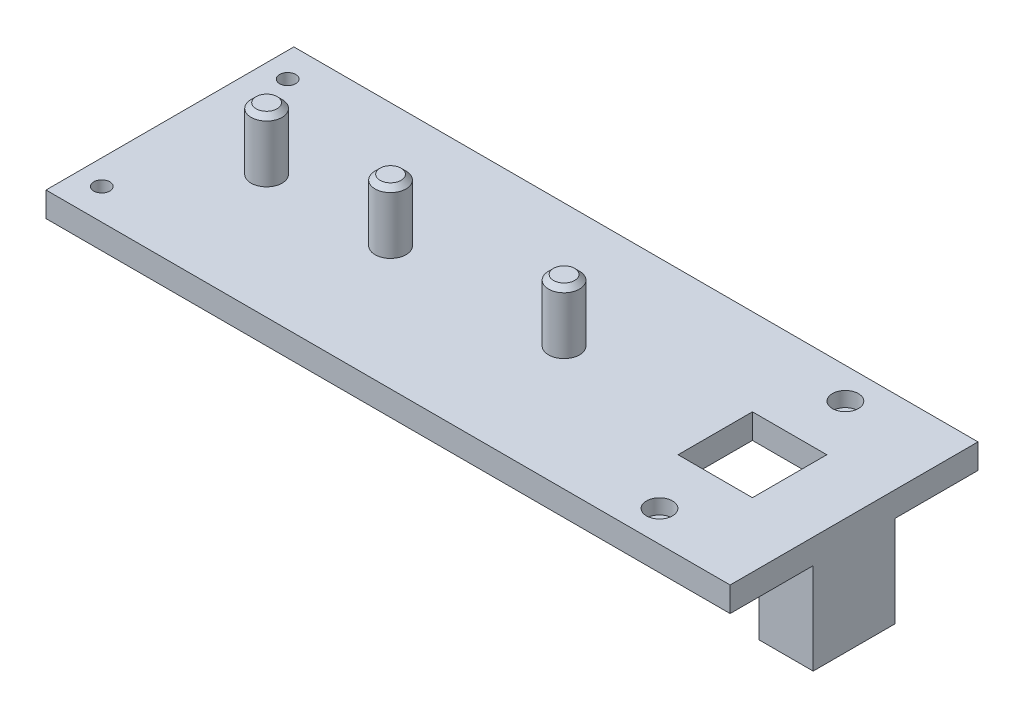
ISO-10303-21;
HEADER;
FILE_DESCRIPTION(('STEP AP214'),'2;1');
FILE_NAME('part.step','',(''),(''),'','','');
FILE_SCHEMA(('AUTOMOTIVE_DESIGN { 1 0 10303 214 1 1 1 1 }'));
ENDSEC;
DATA;
#1=APPLICATION_CONTEXT('core data for automotive mechanical design processes');
#2=APPLICATION_PROTOCOL_DEFINITION('international standard','automotive_design',2000,#1);
#3=PRODUCT_CONTEXT('',#1,'mechanical');
#4=PRODUCT('Part','Part','',(#3));
#5=PRODUCT_RELATED_PRODUCT_CATEGORY('part','',(#4));
#6=PRODUCT_DEFINITION_FORMATION('','',#4);
#7=PRODUCT_DEFINITION_CONTEXT('part definition',#1,'design');
#8=PRODUCT_DEFINITION('design','',#6,#7);
#9=PRODUCT_DEFINITION_SHAPE('','',#8);
#10=(LENGTH_UNIT() NAMED_UNIT(*) SI_UNIT(.MILLI.,.METRE.));
#11=(NAMED_UNIT(*) PLANE_ANGLE_UNIT() SI_UNIT($,.RADIAN.));
#12=(NAMED_UNIT(*) SI_UNIT($,.STERADIAN.) SOLID_ANGLE_UNIT());
#13=UNCERTAINTY_MEASURE_WITH_UNIT(LENGTH_MEASURE(1.E-05),#10,'distance_accuracy_value','');
#14=(GEOMETRIC_REPRESENTATION_CONTEXT(3) GLOBAL_UNCERTAINTY_ASSIGNED_CONTEXT((#13)) GLOBAL_UNIT_ASSIGNED_CONTEXT((#10,
#11,#12)) REPRESENTATION_CONTEXT('',''));
#15=CARTESIAN_POINT('',(0.,0.,0.));
#16=DIRECTION('',(0.,0.,1.));
#17=DIRECTION('',(1.,0.,0.));
#18=AXIS2_PLACEMENT_3D('',#15,#16,#17);
#19=CARTESIAN_POINT('',(-15.9999999999996,-11.,50.0000000000001));
#20=DIRECTION('',(-1.,0.,0.));
#21=DIRECTION('',(0.,0.,1.));
#22=AXIS2_PLACEMENT_3D('',#19,#20,#21);
#23=PLANE('',#22);
#24=DIRECTION('',(0.,-1.,0.));
#25=VECTOR('',#24,1.);
#26=CARTESIAN_POINT('',(-16.,-10.9999999999999,-15.));
#27=LINE('',#26,#25);
#28=CARTESIAN_POINT('',(-16.0000000000001,-11.,-15.));
#29=VERTEX_POINT('',#28);
#30=CARTESIAN_POINT('',(-16.,-20.9999999999999,-15.0000000000001));
#31=VERTEX_POINT('',#30);
#32=EDGE_CURVE('E67',#29,#31,#27,.T.);
#33=ORIENTED_EDGE('',*,*,#32,.F.);
#34=DIRECTION('',(0.,0.,-1.));
#35=VECTOR('',#34,1.);
#36=CARTESIAN_POINT('',(-15.9999999999996,-11.,50.0000000000001));
#37=LINE('',#36,#35);
#38=CARTESIAN_POINT('',(-16.,-11.,15.));
#39=VERTEX_POINT('',#38);
#40=EDGE_CURVE('E370',#39,#29,#37,.T.);
#41=ORIENTED_EDGE('',*,*,#40,.F.);
#42=DIRECTION('',(0.,-1.,0.));
#43=VECTOR('',#42,1.);
#44=CARTESIAN_POINT('',(-16.,-11.,15.));
#45=LINE('',#44,#43);
#46=CARTESIAN_POINT('',(-15.9999999999999,-21.,14.9999999999999));
#47=VERTEX_POINT('',#46);
#48=EDGE_CURVE('E310',#39,#47,#45,.T.);
#49=ORIENTED_EDGE('',*,*,#48,.T.);
#50=DIRECTION('',(0.,0.,-1.));
#51=VECTOR('',#50,1.);
#52=CARTESIAN_POINT('',(-15.9999999999996,-21.,50.0000000000001));
#53=LINE('',#52,#51);
#54=EDGE_CURVE('E379',#47,#31,#53,.T.);
#55=ORIENTED_EDGE('',*,*,#54,.T.);
#56=EDGE_LOOP('',(#33,#41,#49,#55));
#57=FACE_BOUND('',#56,.T.);
#58=ADVANCED_FACE('F51',(#57),#23,.F.);
#59=CARTESIAN_POINT('',(-236.,-11.,50.0000000000016));
#60=DIRECTION('',(1.,0.,0.));
#61=DIRECTION('',(0.,0.,-1.));
#62=AXIS2_PLACEMENT_3D('',#59,#60,#61);
#63=PLANE('',#62);
#64=DIRECTION('',(0.,0.,1.));
#65=VECTOR('',#64,1.);
#66=CARTESIAN_POINT('',(-236.,-21.,50.0000000000016));
#67=LINE('',#66,#65);
#68=CARTESIAN_POINT('',(-236.,-21.,-49.9999999999984));
#69=VERTEX_POINT('',#68);
#70=CARTESIAN_POINT('',(-236.,-21.,50.0000000000016));
#71=VERTEX_POINT('',#70);
#72=EDGE_CURVE('E356',#69,#71,#67,.T.);
#73=ORIENTED_EDGE('',*,*,#72,.T.);
#74=DIRECTION('',(0.,-1.,0.));
#75=VECTOR('',#74,1.);
#76=CARTESIAN_POINT('',(-236.,-11.,50.0000000000016));
#77=LINE('',#76,#75);
#78=CARTESIAN_POINT('',(-236.,-11.,50.0000000000016));
#79=VERTEX_POINT('',#78);
#80=EDGE_CURVE('E384',#79,#71,#77,.T.);
#81=ORIENTED_EDGE('',*,*,#80,.F.);
#82=DIRECTION('',(0.,0.,1.));
#83=VECTOR('',#82,1.);
#84=CARTESIAN_POINT('',(-236.,-11.,50.0000000000016));
#85=LINE('',#84,#83);
#86=CARTESIAN_POINT('',(-236.,-11.,-49.9999999999984));
#87=VERTEX_POINT('',#86);
#88=EDGE_CURVE('E365',#87,#79,#85,.T.);
#89=ORIENTED_EDGE('',*,*,#88,.F.);
#90=DIRECTION('',(0.,-1.,0.));
#91=VECTOR('',#90,1.);
#92=CARTESIAN_POINT('',(-236.,-11.,-49.9999999999984));
#93=LINE('',#92,#91);
#94=EDGE_CURVE('E374',#87,#69,#93,.T.);
#95=ORIENTED_EDGE('',*,*,#94,.T.);
#96=EDGE_LOOP('',(#73,#81,#89,#95));
#97=FACE_BOUND('',#96,.T.);
#98=ADVANCED_FACE('F413',(#97),#63,.F.);
#99=CARTESIAN_POINT('',(-15.9999999999996,-11.,50.0000000000001));
#100=DIRECTION('',(0.,0.,-1.));
#101=DIRECTION('',(-1.,0.,0.));
#102=AXIS2_PLACEMENT_3D('',#99,#100,#101);
#103=PLANE('',#102);
#104=DIRECTION('',(1.,0.,0.));
#105=VECTOR('',#104,1.);
#106=CARTESIAN_POINT('',(-15.9999999999996,-21.,50.0000000000001));
#107=LINE('',#106,#105);
#108=CARTESIAN_POINT('',(40.,-21.0000000000002,49.9999999999999));
#109=VERTEX_POINT('',#108);
#110=EDGE_CURVE('E377',#71,#109,#107,.T.);
#111=ORIENTED_EDGE('',*,*,#110,.T.);
#112=DIRECTION('',(0.,-1.,0.));
#113=VECTOR('',#112,1.);
#114=CARTESIAN_POINT('',(40.,-11.0000000000002,50.));
#115=LINE('',#114,#113);
#116=CARTESIAN_POINT('',(40.,-11.0000000000002,50.));
#117=VERTEX_POINT('',#116);
#118=EDGE_CURVE('E320',#117,#109,#115,.T.);
#119=ORIENTED_EDGE('',*,*,#118,.F.);
#120=DIRECTION('',(1.,0.,0.));
#121=VECTOR('',#120,1.);
#122=CARTESIAN_POINT('',(-15.9999999999996,-11.,50.0000000000001));
#123=LINE('',#122,#121);
#124=EDGE_CURVE('E367',#79,#117,#123,.T.);
#125=ORIENTED_EDGE('',*,*,#124,.F.);
#126=ORIENTED_EDGE('',*,*,#80,.T.);
#127=EDGE_LOOP('',(#111,#119,#125,#126));
#128=FACE_BOUND('',#127,.T.);
#129=ADVANCED_FACE('F418',(#128),#103,.F.);
#130=CARTESIAN_POINT('',(-16.0000000000004,-11.,-49.9999999999999));
#131=DIRECTION('',(0.,0.,1.));
#132=DIRECTION('',(1.,0.,0.));
#133=AXIS2_PLACEMENT_3D('',#130,#131,#132);
#134=PLANE('',#133);
#135=ORIENTED_EDGE('',*,*,#94,.F.);
#136=DIRECTION('',(-1.,0.,0.));
#137=VECTOR('',#136,1.);
#138=CARTESIAN_POINT('',(-16.0000000000004,-11.,-49.9999999999999));
#139=LINE('',#138,#137);
#140=CARTESIAN_POINT('',(40.,-10.9999999999998,-50.));
#141=VERTEX_POINT('',#140);
#142=EDGE_CURVE('E372',#141,#87,#139,.T.);
#143=ORIENTED_EDGE('',*,*,#142,.F.);
#144=DIRECTION('',(0.,-1.,0.));
#145=VECTOR('',#144,1.);
#146=CARTESIAN_POINT('',(40.,-10.9999999999998,-50.));
#147=LINE('',#146,#145);
#148=CARTESIAN_POINT('',(40.,-20.9999999999998,-50.0000000000001));
#149=VERTEX_POINT('',#148);
#150=EDGE_CURVE('E324',#141,#149,#147,.T.);
#151=ORIENTED_EDGE('',*,*,#150,.T.);
#152=DIRECTION('',(-1.,0.,0.));
#153=VECTOR('',#152,1.);
#154=CARTESIAN_POINT('',(-16.0000000000004,-21.,-49.9999999999999));
#155=LINE('',#154,#153);
#156=EDGE_CURVE('E368',#149,#69,#155,.T.);
#157=ORIENTED_EDGE('',*,*,#156,.T.);
#158=EDGE_LOOP('',(#135,#143,#151,#157));
#159=FACE_BOUND('',#158,.T.);
#160=ADVANCED_FACE('F423',(#159),#134,.F.);
#161=CARTESIAN_POINT('',(-126.,-11.,8.74300631892311E-13));
#162=DIRECTION('',(0.,1.,0.));
#163=DIRECTION('',(0.,0.,-1.));
#164=AXIS2_PLACEMENT_3D('',#161,#162,#163);
#165=PLANE('',#164);
#166=CARTESIAN_POINT('',(-197.,-11.,0.));
#167=DIRECTION('',(0.,1.,0.));
#168=DIRECTION('',(0.,0.,1.));
#169=AXIS2_PLACEMENT_3D('',#166,#167,#168);
#170=CIRCLE('',#169,6.25);
#171=CARTESIAN_POINT('',(-197.,-11.,6.25));
#172=VERTEX_POINT('',#171);
#173=EDGE_CURVE('E617',#172,#172,#170,.T.);
#174=ORIENTED_EDGE('',*,*,#173,.F.);
#175=EDGE_LOOP('',(#174));
#176=FACE_BOUND('',#175,.T.);
#177=CARTESIAN_POINT('',(-147.,-11.,0.));
#178=DIRECTION('',(0.,1.,0.));
#179=DIRECTION('',(0.,0.,1.));
#180=AXIS2_PLACEMENT_3D('',#177,#178,#179);
#181=CIRCLE('',#180,6.25);
#182=CARTESIAN_POINT('',(-147.,-11.,6.25));
#183=VERTEX_POINT('',#182);
#184=EDGE_CURVE('E766',#183,#183,#181,.T.);
#185=ORIENTED_EDGE('',*,*,#184,.F.);
#186=EDGE_LOOP('',(#185));
#187=FACE_BOUND('',#186,.T.);
#188=CARTESIAN_POINT('',(-77.0000000000003,-11.,0.));
#189=DIRECTION('',(0.,1.,0.));
#190=DIRECTION('',(0.,0.,1.));
#191=AXIS2_PLACEMENT_3D('',#188,#189,#190);
#192=CIRCLE('',#191,6.25);
#193=CARTESIAN_POINT('',(-77.0000000000003,-11.,6.25));
#194=VERTEX_POINT('',#193);
#195=EDGE_CURVE('E769',#194,#194,#192,.T.);
#196=ORIENTED_EDGE('',*,*,#195,.F.);
#197=EDGE_LOOP('',(#196));
#198=FACE_BOUND('',#197,.T.);
#199=ORIENTED_EDGE('',*,*,#40,.T.);
#200=DIRECTION('',(-1.,0.,0.));
#201=VECTOR('',#200,1.);
#202=CARTESIAN_POINT('',(-16.,-10.9999999999999,-15.));
#203=LINE('',#202,#201);
#204=CARTESIAN_POINT('',(14.,-10.9999999999999,-15.));
#205=VERTEX_POINT('',#204);
#206=EDGE_CURVE('E304',#205,#29,#203,.T.);
#207=ORIENTED_EDGE('',*,*,#206,.F.);
#208=DIRECTION('',(0.,0.,-1.));
#209=VECTOR('',#208,1.);
#210=CARTESIAN_POINT('',(14.,-11.,15.));
#211=LINE('',#210,#209);
#212=CARTESIAN_POINT('',(14.,-11.,15.));
#213=VERTEX_POINT('',#212);
#214=EDGE_CURVE('E300',#213,#205,#211,.T.);
#215=ORIENTED_EDGE('',*,*,#214,.F.);
#216=DIRECTION('',(1.,0.,0.));
#217=VECTOR('',#216,1.);
#218=CARTESIAN_POINT('',(-16.,-11.,15.));
#219=LINE('',#218,#217);
#220=EDGE_CURVE('E297',#39,#213,#219,.T.);
#221=ORIENTED_EDGE('',*,*,#220,.F.);
#222=EDGE_LOOP('',(#199,#207,#215,#221));
#223=FACE_BOUND('',#222,.T.);
#224=ORIENTED_EDGE('',*,*,#142,.T.);
#225=ORIENTED_EDGE('',*,*,#88,.T.);
#226=ORIENTED_EDGE('',*,*,#124,.T.);
#227=DIRECTION('',(0.,0.,1.));
#228=VECTOR('',#227,1.);
#229=CARTESIAN_POINT('',(40.,-11.0000000000002,50.));
#230=LINE('',#229,#228);
#231=EDGE_CURVE('E307',#141,#117,#230,.T.);
#232=ORIENTED_EDGE('',*,*,#231,.F.);
#233=EDGE_LOOP('',(#224,#225,#226,#232));
#234=FACE_BOUND('',#233,.T.);
#235=CARTESIAN_POINT('',(-226.,-11.,-37.4999999999984));
#236=DIRECTION('',(0.,1.,0.));
#237=DIRECTION('',(0.,0.,-1.));
#238=AXIS2_PLACEMENT_3D('',#235,#236,#237);
#239=CIRCLE('',#238,3.25000000000001);
#240=CARTESIAN_POINT('',(-226.,-11.,-40.7499999999984));
#241=VERTEX_POINT('',#240);
#242=EDGE_CURVE('E323',#241,#241,#239,.T.);
#243=ORIENTED_EDGE('',*,*,#242,.F.);
#244=EDGE_LOOP('',(#243));
#245=FACE_BOUND('',#244,.T.);
#246=CARTESIAN_POINT('',(-1.,-10.9999999999999,-37.5));
#247=DIRECTION('',(0.,1.,0.));
#248=DIRECTION('',(-1.,0.,0.));
#249=AXIS2_PLACEMENT_3D('',#246,#247,#248);
#250=CIRCLE('',#249,5.25);
#251=CARTESIAN_POINT('',(-6.25,-10.9999999999999,-37.5));
#252=VERTEX_POINT('',#251);
#253=EDGE_CURVE('E600',#252,#252,#250,.T.);
#254=ORIENTED_EDGE('',*,*,#253,.F.);
#255=EDGE_LOOP('',(#254));
#256=FACE_BOUND('',#255,.T.);
#257=CARTESIAN_POINT('',(-1.,-11.0000000000001,37.5));
#258=DIRECTION('',(0.,1.,0.));
#259=DIRECTION('',(-1.,0.,0.));
#260=AXIS2_PLACEMENT_3D('',#257,#258,#259);
#261=CIRCLE('',#260,5.25);
#262=CARTESIAN_POINT('',(-6.25,-11.0000000000001,37.5));
#263=VERTEX_POINT('',#262);
#264=EDGE_CURVE('E604',#263,#263,#261,.T.);
#265=ORIENTED_EDGE('',*,*,#264,.F.);
#266=EDGE_LOOP('',(#265));
#267=FACE_BOUND('',#266,.T.);
#268=CARTESIAN_POINT('',(-226.,-11.,37.5000000000016));
#269=DIRECTION('',(0.,1.,0.));
#270=DIRECTION('',(0.,0.,-1.));
#271=AXIS2_PLACEMENT_3D('',#268,#269,#270);
#272=CIRCLE('',#271,3.25000000000001);
#273=CARTESIAN_POINT('',(-226.,-11.,34.2500000000016));
#274=VERTEX_POINT('',#273);
#275=EDGE_CURVE('E357',#274,#274,#272,.T.);
#276=ORIENTED_EDGE('',*,*,#275,.F.);
#277=EDGE_LOOP('',(#276));
#278=FACE_BOUND('',#277,.T.);
#279=ADVANCED_FACE('F561',(#176,#187,#198,#223,#234,#245,#256,#267,#278),#165,.T.);
#280=CARTESIAN_POINT('',(-126.,-21.,8.74300631892311E-13));
#281=DIRECTION('',(0.,1.,0.));
#282=DIRECTION('',(0.,0.,-1.));
#283=AXIS2_PLACEMENT_3D('',#280,#281,#282);
#284=PLANE('',#283);
#285=ORIENTED_EDGE('',*,*,#156,.F.);
#286=DIRECTION('',(0.,0.,1.));
#287=VECTOR('',#286,1.);
#288=CARTESIAN_POINT('',(40.,-21.0000000000002,49.9999999999999));
#289=LINE('',#288,#287);
#290=CARTESIAN_POINT('',(40.,-20.9999999999999,-16.5000000000001));
#291=VERTEX_POINT('',#290);
#292=EDGE_CURVE('E301',#149,#291,#289,.T.);
#293=ORIENTED_EDGE('',*,*,#292,.T.);
#294=DIRECTION('',(1.,0.,0.));
#295=VECTOR('',#294,1.);
#296=CARTESIAN_POINT('',(18.12,-20.9999999999999,-16.5000000000001));
#297=LINE('',#296,#295);
#298=CARTESIAN_POINT('',(18.12,-20.9999999999999,-16.5000000000001));
#299=VERTEX_POINT('',#298);
#300=EDGE_CURVE('E266',#299,#291,#297,.T.);
#301=ORIENTED_EDGE('',*,*,#300,.F.);
#302=DIRECTION('',(0.,0.,-1.));
#303=VECTOR('',#302,1.);
#304=CARTESIAN_POINT('',(18.12,-21.,-12.5000000000001));
#305=LINE('',#304,#303);
#306=CARTESIAN_POINT('',(18.12,-21.,-12.5000000000001));
#307=VERTEX_POINT('',#306);
#308=EDGE_CURVE('E263',#307,#299,#305,.T.);
#309=ORIENTED_EDGE('',*,*,#308,.F.);
#310=DIRECTION('',(-1.,0.,0.));
#311=VECTOR('',#310,1.);
#312=CARTESIAN_POINT('',(35.12,-21.,-12.5000000000001));
#313=LINE('',#312,#311);
#314=CARTESIAN_POINT('',(35.12,-21.,-12.5000000000001));
#315=VERTEX_POINT('',#314);
#316=EDGE_CURVE('E260',#315,#307,#313,.T.);
#317=ORIENTED_EDGE('',*,*,#316,.F.);
#318=DIRECTION('',(0.,0.,-1.));
#319=VECTOR('',#318,1.);
#320=CARTESIAN_POINT('',(35.12,-21.,12.4999999999999));
#321=LINE('',#320,#319);
#322=CARTESIAN_POINT('',(35.12,-21.,12.4999999999999));
#323=VERTEX_POINT('',#322);
#324=EDGE_CURVE('E246',#323,#315,#321,.T.);
#325=ORIENTED_EDGE('',*,*,#324,.F.);
#326=DIRECTION('',(-1.,0.,0.));
#327=VECTOR('',#326,1.);
#328=CARTESIAN_POINT('',(35.12,-21.,12.4999999999999));
#329=LINE('',#328,#327);
#330=CARTESIAN_POINT('',(18.12,-21.,12.4999999999999));
#331=VERTEX_POINT('',#330);
#332=EDGE_CURVE('E251',#323,#331,#329,.T.);
#333=ORIENTED_EDGE('',*,*,#332,.T.);
#334=DIRECTION('',(0.,0.,1.));
#335=VECTOR('',#334,1.);
#336=CARTESIAN_POINT('',(18.12,-21.,12.4999999999999));
#337=LINE('',#336,#335);
#338=CARTESIAN_POINT('',(18.12,-21.0000000000001,16.4999999999999));
#339=VERTEX_POINT('',#338);
#340=EDGE_CURVE('E271',#331,#339,#337,.T.);
#341=ORIENTED_EDGE('',*,*,#340,.T.);
#342=DIRECTION('',(1.,0.,0.));
#343=VECTOR('',#342,1.);
#344=CARTESIAN_POINT('',(18.12,-21.0000000000001,16.4999999999999));
#345=LINE('',#344,#343);
#346=CARTESIAN_POINT('',(40.,-21.0000000000001,16.4999999999999));
#347=VERTEX_POINT('',#346);
#348=EDGE_CURVE('E269',#339,#347,#345,.T.);
#349=ORIENTED_EDGE('',*,*,#348,.T.);
#350=EDGE_CURVE('E318',#347,#109,#289,.T.);
#351=ORIENTED_EDGE('',*,*,#350,.T.);
#352=ORIENTED_EDGE('',*,*,#110,.F.);
#353=ORIENTED_EDGE('',*,*,#72,.F.);
#354=EDGE_LOOP('',(#285,#293,#301,#309,#317,#325,#333,#341,#349,#351,#352,#353));
#355=FACE_BOUND('',#354,.T.);
#356=CARTESIAN_POINT('',(-226.,-21.,-37.4999999999984));
#357=DIRECTION('',(0.,1.,0.));
#358=DIRECTION('',(0.,0.,-1.));
#359=AXIS2_PLACEMENT_3D('',#356,#357,#358);
#360=CIRCLE('',#359,3.25000000000001);
#361=CARTESIAN_POINT('',(-226.,-21.,-40.7499999999984));
#362=VERTEX_POINT('',#361);
#363=EDGE_CURVE('E360',#362,#362,#360,.T.);
#364=ORIENTED_EDGE('',*,*,#363,.T.);
#365=EDGE_LOOP('',(#364));
#366=FACE_BOUND('',#365,.T.);
#367=CARTESIAN_POINT('',(-226.,-21.,37.5000000000016));
#368=DIRECTION('',(0.,1.,0.));
#369=DIRECTION('',(0.,0.,-1.));
#370=AXIS2_PLACEMENT_3D('',#367,#368,#369);
#371=CIRCLE('',#370,3.25000000000001);
#372=CARTESIAN_POINT('',(-226.,-21.,34.2500000000016));
#373=VERTEX_POINT('',#372);
#374=EDGE_CURVE('E353',#373,#373,#371,.T.);
#375=ORIENTED_EDGE('',*,*,#374,.T.);
#376=EDGE_LOOP('',(#375));
#377=FACE_BOUND('',#376,.T.);
#378=DIRECTION('',(-1.,0.,0.));
#379=VECTOR('',#378,1.);
#380=CARTESIAN_POINT('',(-16.,-20.9999999999999,-15.0000000000001));
#381=LINE('',#380,#379);
#382=CARTESIAN_POINT('',(14.,-20.9999999999999,-15.0000000000001));
#383=VERTEX_POINT('',#382);
#384=EDGE_CURVE('E315',#383,#31,#381,.T.);
#385=ORIENTED_EDGE('',*,*,#384,.T.);
#386=ORIENTED_EDGE('',*,*,#54,.F.);
#387=DIRECTION('',(1.,0.,0.));
#388=VECTOR('',#387,1.);
#389=CARTESIAN_POINT('',(-16.,-21.,14.9999999999999));
#390=LINE('',#389,#388);
#391=CARTESIAN_POINT('',(14.,-21.,14.9999999999999));
#392=VERTEX_POINT('',#391);
#393=EDGE_CURVE('E75',#47,#392,#390,.T.);
#394=ORIENTED_EDGE('',*,*,#393,.T.);
#395=DIRECTION('',(0.,0.,-1.));
#396=VECTOR('',#395,1.);
#397=CARTESIAN_POINT('',(14.,-21.,14.9999999999999));
#398=LINE('',#397,#396);
#399=EDGE_CURVE('E312',#392,#383,#398,.T.);
#400=ORIENTED_EDGE('',*,*,#399,.T.);
#401=EDGE_LOOP('',(#385,#386,#394,#400));
#402=FACE_BOUND('',#401,.T.);
#403=CARTESIAN_POINT('',(-1.,-21.0000000000001,37.4999999999999));
#404=DIRECTION('',(0.,1.,0.));
#405=DIRECTION('',(-1.,0.,0.));
#406=AXIS2_PLACEMENT_3D('',#403,#404,#405);
#407=CIRCLE('',#406,3.2);
#408=CARTESIAN_POINT('',(-4.2,-21.0000000000001,37.4999999999999));
#409=VERTEX_POINT('',#408);
#410=EDGE_CURVE('E342',#409,#409,#407,.T.);
#411=ORIENTED_EDGE('',*,*,#410,.T.);
#412=EDGE_LOOP('',(#411));
#413=FACE_BOUND('',#412,.T.);
#414=CARTESIAN_POINT('',(-1.,-20.9999999999999,-37.5000000000001));
#415=DIRECTION('',(0.,1.,0.));
#416=DIRECTION('',(-1.,0.,0.));
#417=AXIS2_PLACEMENT_3D('',#414,#415,#416);
#418=CIRCLE('',#417,3.2);
#419=CARTESIAN_POINT('',(-4.2,-20.9999999999999,-37.5000000000001));
#420=VERTEX_POINT('',#419);
#421=EDGE_CURVE('E339',#420,#420,#418,.T.);
#422=ORIENTED_EDGE('',*,*,#421,.T.);
#423=EDGE_LOOP('',(#422));
#424=FACE_BOUND('',#423,.T.);
#425=ADVANCED_FACE('F556',(#355,#366,#377,#402,#413,#424),#284,.F.);
#426=CARTESIAN_POINT('',(-226.,-21.,37.5000000000016));
#427=DIRECTION('',(0.,1.,0.));
#428=DIRECTION('',(0.,0.,-1.));
#429=AXIS2_PLACEMENT_3D('',#426,#427,#428);
#430=CYLINDRICAL_SURFACE('',#429,3.25000000000001);
#431=ORIENTED_EDGE('',*,*,#374,.F.);
#432=EDGE_LOOP('',(#431));
#433=FACE_BOUND('',#432,.T.);
#434=ORIENTED_EDGE('',*,*,#275,.T.);
#435=EDGE_LOOP('',(#434));
#436=FACE_BOUND('',#435,.T.);
#437=ADVANCED_FACE('F553',(#433,#436),#430,.F.);
#438=CARTESIAN_POINT('',(-226.,-21.,-37.4999999999984));
#439=DIRECTION('',(0.,1.,0.));
#440=DIRECTION('',(0.,0.,-1.));
#441=AXIS2_PLACEMENT_3D('',#438,#439,#440);
#442=CYLINDRICAL_SURFACE('',#441,3.25000000000001);
#443=ORIENTED_EDGE('',*,*,#363,.F.);
#444=EDGE_LOOP('',(#443));
#445=FACE_BOUND('',#444,.T.);
#446=ORIENTED_EDGE('',*,*,#242,.T.);
#447=EDGE_LOOP('',(#446));
#448=FACE_BOUND('',#447,.T.);
#449=ADVANCED_FACE('F488',(#445,#448),#442,.F.);
#450=CARTESIAN_POINT('',(-1.,-26.9999999999999,-37.5000000000001));
#451=DIRECTION('',(0.,1.,0.));
#452=DIRECTION('',(-1.,0.,0.));
#453=AXIS2_PLACEMENT_3D('',#450,#451,#452);
#454=CYLINDRICAL_SURFACE('',#453,3.2);
#455=ORIENTED_EDGE('',*,*,#421,.F.);
#456=EDGE_LOOP('',(#455));
#457=FACE_BOUND('',#456,.T.);
#458=CARTESIAN_POINT('',(-1.,-16.9999999999999,-37.5000000000001));
#459=DIRECTION('',(0.,1.,0.));
#460=DIRECTION('',(-1.,0.,0.));
#461=AXIS2_PLACEMENT_3D('',#458,#459,#460);
#462=CIRCLE('',#461,3.2);
#463=CARTESIAN_POINT('',(-4.2,-16.9999999999999,-37.5000000000001));
#464=VERTEX_POINT('',#463);
#465=EDGE_CURVE('E343',#464,#464,#462,.F.);
#466=ORIENTED_EDGE('',*,*,#465,.F.);
#467=EDGE_LOOP('',(#466));
#468=FACE_BOUND('',#467,.T.);
#469=ADVANCED_FACE('F484',(#457,#468),#454,.F.);
#470=CARTESIAN_POINT('',(-1.,-27.0000000000001,37.4999999999999));
#471=DIRECTION('',(0.,1.,0.));
#472=DIRECTION('',(-1.,0.,0.));
#473=AXIS2_PLACEMENT_3D('',#470,#471,#472);
#474=CYLINDRICAL_SURFACE('',#473,3.2);
#475=ORIENTED_EDGE('',*,*,#410,.F.);
#476=EDGE_LOOP('',(#475));
#477=FACE_BOUND('',#476,.T.);
#478=CARTESIAN_POINT('',(-1.,-17.0000000000001,37.5));
#479=DIRECTION('',(0.,1.,0.));
#480=DIRECTION('',(-1.,0.,0.));
#481=AXIS2_PLACEMENT_3D('',#478,#479,#480);
#482=CIRCLE('',#481,3.2);
#483=CARTESIAN_POINT('',(-4.2,-17.0000000000001,37.5));
#484=VERTEX_POINT('',#483);
#485=EDGE_CURVE('E347',#484,#484,#482,.F.);
#486=ORIENTED_EDGE('',*,*,#485,.F.);
#487=EDGE_LOOP('',(#486));
#488=FACE_BOUND('',#487,.T.);
#489=ADVANCED_FACE('F480',(#477,#488),#474,.F.);
#490=CARTESIAN_POINT('',(40.,-11.0000000000002,50.));
#491=DIRECTION('',(1.,0.,0.));
#492=DIRECTION('',(0.,0.,1.));
#493=AXIS2_PLACEMENT_3D('',#490,#491,#492);
#494=PLANE('',#493);
#495=ORIENTED_EDGE('',*,*,#292,.F.);
#496=ORIENTED_EDGE('',*,*,#150,.F.);
#497=ORIENTED_EDGE('',*,*,#231,.T.);
#498=ORIENTED_EDGE('',*,*,#118,.T.);
#499=ORIENTED_EDGE('',*,*,#350,.F.);
#500=DIRECTION('',(0.,1.,0.));
#501=VECTOR('',#500,1.);
#502=CARTESIAN_POINT('',(40.,-54.8500000000001,16.4999999999998));
#503=LINE('',#502,#501);
#504=CARTESIAN_POINT('',(40.,-57.8500000000001,16.4999999999998));
#505=VERTEX_POINT('',#504);
#506=EDGE_CURVE('E282',#505,#347,#503,.T.);
#507=ORIENTED_EDGE('',*,*,#506,.F.);
#508=DIRECTION('',(0.,0.,1.));
#509=VECTOR('',#508,1.);
#510=CARTESIAN_POINT('',(40.,-57.8500000000001,16.4999999999998));
#511=LINE('',#510,#509);
#512=CARTESIAN_POINT('',(40.,-57.8499999999999,-16.5000000000002));
#513=VERTEX_POINT('',#512);
#514=EDGE_CURVE('E240',#513,#505,#511,.T.);
#515=ORIENTED_EDGE('',*,*,#514,.F.);
#516=DIRECTION('',(0.,1.,0.));
#517=VECTOR('',#516,1.);
#518=CARTESIAN_POINT('',(40.,-54.8499999999999,-16.5000000000002));
#519=LINE('',#518,#517);
#520=EDGE_CURVE('E285',#513,#291,#519,.T.);
#521=ORIENTED_EDGE('',*,*,#520,.T.);
#522=EDGE_LOOP('',(#495,#496,#497,#498,#499,#507,#515,#521));
#523=FACE_BOUND('',#522,.T.);
#524=ADVANCED_FACE('F483',(#523),#494,.T.);
#525=CARTESIAN_POINT('',(-16.,-10.9999999999999,-15.));
#526=DIRECTION('',(0.,0.,1.));
#527=DIRECTION('',(-1.,0.,0.));
#528=AXIS2_PLACEMENT_3D('',#525,#526,#527);
#529=PLANE('',#528);
#530=ORIENTED_EDGE('',*,*,#384,.F.);
#531=DIRECTION('',(0.,-1.,0.));
#532=VECTOR('',#531,1.);
#533=CARTESIAN_POINT('',(14.,-10.9999999999999,-15.));
#534=LINE('',#533,#532);
#535=EDGE_CURVE('E328',#205,#383,#534,.T.);
#536=ORIENTED_EDGE('',*,*,#535,.F.);
#537=ORIENTED_EDGE('',*,*,#206,.T.);
#538=ORIENTED_EDGE('',*,*,#32,.T.);
#539=EDGE_LOOP('',(#530,#536,#537,#538));
#540=FACE_BOUND('',#539,.T.);
#541=ADVANCED_FACE('F542',(#540),#529,.T.);
#542=CARTESIAN_POINT('',(14.,-11.,15.));
#543=DIRECTION('',(-1.,0.,0.));
#544=DIRECTION('',(0.,0.,-1.));
#545=AXIS2_PLACEMENT_3D('',#542,#543,#544);
#546=PLANE('',#545);
#547=ORIENTED_EDGE('',*,*,#399,.F.);
#548=DIRECTION('',(0.,-1.,0.));
#549=VECTOR('',#548,1.);
#550=CARTESIAN_POINT('',(14.,-11.,15.));
#551=LINE('',#550,#549);
#552=EDGE_CURVE('E330',#213,#392,#551,.T.);
#553=ORIENTED_EDGE('',*,*,#552,.F.);
#554=ORIENTED_EDGE('',*,*,#214,.T.);
#555=ORIENTED_EDGE('',*,*,#535,.T.);
#556=EDGE_LOOP('',(#547,#553,#554,#555));
#557=FACE_BOUND('',#556,.T.);
#558=ADVANCED_FACE('F546',(#557),#546,.T.);
#559=CARTESIAN_POINT('',(-16.,-11.,15.));
#560=DIRECTION('',(0.,0.,-1.));
#561=DIRECTION('',(1.,0.,0.));
#562=AXIS2_PLACEMENT_3D('',#559,#560,#561);
#563=PLANE('',#562);
#564=ORIENTED_EDGE('',*,*,#393,.F.);
#565=ORIENTED_EDGE('',*,*,#48,.F.);
#566=ORIENTED_EDGE('',*,*,#220,.T.);
#567=ORIENTED_EDGE('',*,*,#552,.T.);
#568=EDGE_LOOP('',(#564,#565,#566,#567));
#569=FACE_BOUND('',#568,.T.);
#570=ADVANCED_FACE('F538',(#569),#563,.T.);
#571=CARTESIAN_POINT('',(35.12,-54.85,12.4999999999998));
#572=DIRECTION('',(1.,0.,0.));
#573=DIRECTION('',(0.,1.,0.));
#574=AXIS2_PLACEMENT_3D('',#571,#572,#573);
#575=PLANE('',#574);
#576=ORIENTED_EDGE('',*,*,#324,.T.);
#577=DIRECTION('',(0.,1.,0.));
#578=VECTOR('',#577,1.);
#579=CARTESIAN_POINT('',(35.12,-54.85,-12.5000000000002));
#580=LINE('',#579,#578);
#581=CARTESIAN_POINT('',(35.12,-54.85,-12.5000000000002));
#582=VERTEX_POINT('',#581);
#583=EDGE_CURVE('E294',#582,#315,#580,.T.);
#584=ORIENTED_EDGE('',*,*,#583,.F.);
#585=DIRECTION('',(0.,0.,-1.));
#586=VECTOR('',#585,1.);
#587=CARTESIAN_POINT('',(35.12,-54.85,12.4999999999998));
#588=LINE('',#587,#586);
#589=CARTESIAN_POINT('',(35.12,-54.85,12.4999999999998));
#590=VERTEX_POINT('',#589);
#591=EDGE_CURVE('E248',#590,#582,#588,.T.);
#592=ORIENTED_EDGE('',*,*,#591,.F.);
#593=DIRECTION('',(0.,1.,0.));
#594=VECTOR('',#593,1.);
#595=CARTESIAN_POINT('',(35.12,-54.85,12.4999999999998));
#596=LINE('',#595,#594);
#597=EDGE_CURVE('E257',#590,#323,#596,.T.);
#598=ORIENTED_EDGE('',*,*,#597,.T.);
#599=EDGE_LOOP('',(#576,#584,#592,#598));
#600=FACE_BOUND('',#599,.T.);
#601=ADVANCED_FACE('F534',(#600),#575,.F.);
#602=CARTESIAN_POINT('',(35.12,-54.85,-12.5000000000002));
#603=DIRECTION('',(0.,0.,-1.));
#604=DIRECTION('',(1.,0.,0.));
#605=AXIS2_PLACEMENT_3D('',#602,#603,#604);
#606=PLANE('',#605);
#607=ORIENTED_EDGE('',*,*,#316,.T.);
#608=DIRECTION('',(0.,1.,0.));
#609=VECTOR('',#608,1.);
#610=CARTESIAN_POINT('',(18.12,-54.85,-12.5000000000002));
#611=LINE('',#610,#609);
#612=CARTESIAN_POINT('',(18.12,-54.85,-12.5000000000002));
#613=VERTEX_POINT('',#612);
#614=EDGE_CURVE('E291',#613,#307,#611,.T.);
#615=ORIENTED_EDGE('',*,*,#614,.F.);
#616=DIRECTION('',(-1.,0.,0.));
#617=VECTOR('',#616,1.);
#618=CARTESIAN_POINT('',(35.12,-54.85,-12.5000000000002));
#619=LINE('',#618,#617);
#620=EDGE_CURVE('E250',#582,#613,#619,.T.);
#621=ORIENTED_EDGE('',*,*,#620,.F.);
#622=ORIENTED_EDGE('',*,*,#583,.T.);
#623=EDGE_LOOP('',(#607,#615,#621,#622));
#624=FACE_BOUND('',#623,.T.);
#625=ADVANCED_FACE('F531',(#624),#606,.F.);
#626=CARTESIAN_POINT('',(18.12,-54.85,-12.5000000000002));
#627=DIRECTION('',(1.,0.,0.));
#628=DIRECTION('',(0.,1.,0.));
#629=AXIS2_PLACEMENT_3D('',#626,#627,#628);
#630=PLANE('',#629);
#631=DIRECTION('',(0.,0.,1.));
#632=VECTOR('',#631,1.);
#633=CARTESIAN_POINT('',(18.12,-56.85,9.3849999999998));
#634=LINE('',#633,#632);
#635=CARTESIAN_POINT('',(18.12,-56.85,-9.3850000000002));
#636=VERTEX_POINT('',#635);
#637=CARTESIAN_POINT('',(18.12,-56.85,9.3849999999998));
#638=VERTEX_POINT('',#637);
#639=EDGE_CURVE('E207',#636,#638,#634,.T.);
#640=ORIENTED_EDGE('',*,*,#639,.F.);
#641=DIRECTION('',(0.,1.,0.));
#642=VECTOR('',#641,1.);
#643=CARTESIAN_POINT('',(18.12,-56.85,-9.3850000000002));
#644=LINE('',#643,#642);
#645=CARTESIAN_POINT('',(18.12,-54.85,-9.38500000000019));
#646=VERTEX_POINT('',#645);
#647=EDGE_CURVE('E190',#636,#646,#644,.T.);
#648=ORIENTED_EDGE('',*,*,#647,.T.);
#649=DIRECTION('',(0.,0.,-1.));
#650=VECTOR('',#649,1.);
#651=CARTESIAN_POINT('',(18.12,-54.8500000000001,16.4999999999998));
#652=LINE('',#651,#650);
#653=EDGE_CURVE('E229',#646,#613,#652,.T.);
#654=ORIENTED_EDGE('',*,*,#653,.T.);
#655=ORIENTED_EDGE('',*,*,#614,.T.);
#656=ORIENTED_EDGE('',*,*,#308,.T.);
#657=DIRECTION('',(0.,1.,0.));
#658=VECTOR('',#657,1.);
#659=CARTESIAN_POINT('',(18.12,-54.8499999999999,-16.5000000000002));
#660=LINE('',#659,#658);
#661=CARTESIAN_POINT('',(18.12,-57.8499999999999,-16.5000000000002));
#662=VERTEX_POINT('',#661);
#663=EDGE_CURVE('E288',#662,#299,#660,.T.);
#664=ORIENTED_EDGE('',*,*,#663,.F.);
#665=DIRECTION('',(0.,0.,-1.));
#666=VECTOR('',#665,1.);
#667=CARTESIAN_POINT('',(18.12,-57.8500000000001,16.4999999999998));
#668=LINE('',#667,#666);
#669=CARTESIAN_POINT('',(18.12,-57.8500000000001,16.4999999999998));
#670=VERTEX_POINT('',#669);
#671=EDGE_CURVE('E233',#670,#662,#668,.T.);
#672=ORIENTED_EDGE('',*,*,#671,.F.);
#673=DIRECTION('',(0.,1.,0.));
#674=VECTOR('',#673,1.);
#675=CARTESIAN_POINT('',(18.12,-54.8500000000001,16.4999999999998));
#676=LINE('',#675,#674);
#677=EDGE_CURVE('E279',#670,#339,#676,.T.);
#678=ORIENTED_EDGE('',*,*,#677,.T.);
#679=ORIENTED_EDGE('',*,*,#340,.F.);
#680=DIRECTION('',(0.,1.,0.));
#681=VECTOR('',#680,1.);
#682=CARTESIAN_POINT('',(18.12,-54.85,12.4999999999998));
#683=LINE('',#682,#681);
#684=CARTESIAN_POINT('',(18.12,-54.85,12.4999999999998));
#685=VERTEX_POINT('',#684);
#686=EDGE_CURVE('E276',#685,#331,#683,.T.);
#687=ORIENTED_EDGE('',*,*,#686,.F.);
#688=CARTESIAN_POINT('',(18.12,-54.85,9.38499999999981));
#689=VERTEX_POINT('',#688);
#690=EDGE_CURVE('E237',#685,#689,#652,.T.);
#691=ORIENTED_EDGE('',*,*,#690,.T.);
#692=DIRECTION('',(0.,1.,0.));
#693=VECTOR('',#692,1.);
#694=CARTESIAN_POINT('',(18.12,-56.85,9.3849999999998));
#695=LINE('',#694,#693);
#696=EDGE_CURVE('E200',#638,#689,#695,.T.);
#697=ORIENTED_EDGE('',*,*,#696,.F.);
#698=EDGE_LOOP('',(#640,#648,#654,#655,#656,#664,#672,#678,#679,#687,#691,#697));
#699=FACE_BOUND('',#698,.T.);
#700=ADVANCED_FACE('F212',(#699),#630,.F.);
#701=CARTESIAN_POINT('',(18.12,-54.8499999999999,-16.5000000000002));
#702=DIRECTION('',(0.,0.,1.));
#703=DIRECTION('',(0.,-1.,0.));
#704=AXIS2_PLACEMENT_3D('',#701,#702,#703);
#705=PLANE('',#704);
#706=ORIENTED_EDGE('',*,*,#300,.T.);
#707=ORIENTED_EDGE('',*,*,#520,.F.);
#708=DIRECTION('',(1.,0.,0.));
#709=VECTOR('',#708,1.);
#710=CARTESIAN_POINT('',(18.12,-57.8499999999999,-16.5000000000002));
#711=LINE('',#710,#709);
#712=EDGE_CURVE('E236',#662,#513,#711,.T.);
#713=ORIENTED_EDGE('',*,*,#712,.F.);
#714=ORIENTED_EDGE('',*,*,#663,.T.);
#715=EDGE_LOOP('',(#706,#707,#713,#714));
#716=FACE_BOUND('',#715,.T.);
#717=ADVANCED_FACE('F524',(#716),#705,.F.);
#718=CARTESIAN_POINT('',(18.12,-54.8500000000001,16.4999999999998));
#719=DIRECTION('',(0.,0.,1.));
#720=DIRECTION('',(0.,-1.,0.));
#721=AXIS2_PLACEMENT_3D('',#718,#719,#720);
#722=PLANE('',#721);
#723=ORIENTED_EDGE('',*,*,#348,.F.);
#724=ORIENTED_EDGE('',*,*,#677,.F.);
#725=DIRECTION('',(-1.,0.,0.));
#726=VECTOR('',#725,1.);
#727=CARTESIAN_POINT('',(18.12,-57.8500000000001,16.4999999999998));
#728=LINE('',#727,#726);
#729=EDGE_CURVE('E243',#505,#670,#728,.T.);
#730=ORIENTED_EDGE('',*,*,#729,.F.);
#731=ORIENTED_EDGE('',*,*,#506,.T.);
#732=EDGE_LOOP('',(#723,#724,#730,#731));
#733=FACE_BOUND('',#732,.T.);
#734=ADVANCED_FACE('F520',(#733),#722,.T.);
#735=CARTESIAN_POINT('',(35.12,-54.85,12.4999999999998));
#736=DIRECTION('',(0.,0.,-1.));
#737=DIRECTION('',(1.,0.,0.));
#738=AXIS2_PLACEMENT_3D('',#735,#736,#737);
#739=PLANE('',#738);
#740=ORIENTED_EDGE('',*,*,#332,.F.);
#741=ORIENTED_EDGE('',*,*,#597,.F.);
#742=DIRECTION('',(-1.,0.,0.));
#743=VECTOR('',#742,1.);
#744=CARTESIAN_POINT('',(35.12,-54.85,12.4999999999998));
#745=LINE('',#744,#743);
#746=EDGE_CURVE('E254',#590,#685,#745,.T.);
#747=ORIENTED_EDGE('',*,*,#746,.T.);
#748=ORIENTED_EDGE('',*,*,#686,.T.);
#749=EDGE_LOOP('',(#740,#741,#747,#748));
#750=FACE_BOUND('',#749,.T.);
#751=ADVANCED_FACE('F516',(#750),#739,.T.);
#752=CARTESIAN_POINT('',(0.,-54.85,-1.91507751435546E-13));
#753=DIRECTION('',(0.,-1.,0.));
#754=DIRECTION('',(1.,0.,0.));
#755=AXIS2_PLACEMENT_3D('',#752,#753,#754);
#756=PLANE('',#755);
#757=CARTESIAN_POINT('',(32.82,-54.85,10.1999999999998));
#758=DIRECTION('',(0.,1.,0.));
#759=DIRECTION('',(-1.,0.,0.));
#760=AXIS2_PLACEMENT_3D('',#757,#758,#759);
#761=CIRCLE('',#760,1.15);
#762=CARTESIAN_POINT('',(31.67,-54.85,10.1999999999998));
#763=VERTEX_POINT('',#762);
#764=EDGE_CURVE('E336',#763,#763,#761,.T.);
#765=ORIENTED_EDGE('',*,*,#764,.F.);
#766=EDGE_LOOP('',(#765));
#767=FACE_BOUND('',#766,.T.);
#768=CARTESIAN_POINT('',(32.82,-54.85,-10.2000000000002));
#769=DIRECTION('',(0.,1.,0.));
#770=DIRECTION('',(-1.,0.,0.));
#771=AXIS2_PLACEMENT_3D('',#768,#769,#770);
#772=CIRCLE('',#771,1.15);
#773=CARTESIAN_POINT('',(31.67,-54.85,-10.2000000000002));
#774=VERTEX_POINT('',#773);
#775=EDGE_CURVE('E346',#774,#774,#772,.T.);
#776=ORIENTED_EDGE('',*,*,#775,.F.);
#777=EDGE_LOOP('',(#776));
#778=FACE_BOUND('',#777,.T.);
#779=ORIENTED_EDGE('',*,*,#653,.F.);
#780=DIRECTION('',(-1.,0.,0.));
#781=VECTOR('',#780,1.);
#782=CARTESIAN_POINT('',(29.72,-54.85,-9.38500000000019));
#783=LINE('',#782,#781);
#784=CARTESIAN_POINT('',(29.72,-54.85,-9.38500000000019));
#785=VERTEX_POINT('',#784);
#786=EDGE_CURVE('E196',#785,#646,#783,.T.);
#787=ORIENTED_EDGE('',*,*,#786,.F.);
#788=DIRECTION('',(0.,0.,-1.));
#789=VECTOR('',#788,1.);
#790=CARTESIAN_POINT('',(29.72,-54.85,-9.38500000000019));
#791=LINE('',#790,#789);
#792=CARTESIAN_POINT('',(29.72,-54.85,9.38499999999981));
#793=VERTEX_POINT('',#792);
#794=EDGE_CURVE('E210',#793,#785,#791,.T.);
#795=ORIENTED_EDGE('',*,*,#794,.F.);
#796=DIRECTION('',(1.,0.,0.));
#797=VECTOR('',#796,1.);
#798=CARTESIAN_POINT('',(29.72,-54.85,9.38499999999981));
#799=LINE('',#798,#797);
#800=EDGE_CURVE('E221',#689,#793,#799,.T.);
#801=ORIENTED_EDGE('',*,*,#800,.F.);
#802=ORIENTED_EDGE('',*,*,#690,.F.);
#803=ORIENTED_EDGE('',*,*,#746,.F.);
#804=ORIENTED_EDGE('',*,*,#591,.T.);
#805=ORIENTED_EDGE('',*,*,#620,.T.);
#806=EDGE_LOOP('',(#779,#787,#795,#801,#802,#803,#804,#805));
#807=FACE_BOUND('',#806,.T.);
#808=ADVANCED_FACE('F512',(#767,#778,#807),#756,.F.);
#809=CARTESIAN_POINT('',(0.,-57.85,-2.01982195452075E-13));
#810=DIRECTION('',(0.,-1.,0.));
#811=DIRECTION('',(1.,0.,0.));
#812=AXIS2_PLACEMENT_3D('',#809,#810,#811);
#813=PLANE('',#812);
#814=CARTESIAN_POINT('',(32.82,-57.85,10.1999999999998));
#815=DIRECTION('',(0.,-1.,0.));
#816=DIRECTION('',(1.,0.,0.));
#817=AXIS2_PLACEMENT_3D('',#814,#815,#816);
#818=CIRCLE('',#817,1.15);
#819=CARTESIAN_POINT('',(33.97,-57.85,10.1999999999998));
#820=VERTEX_POINT('',#819);
#821=EDGE_CURVE('E222',#820,#820,#818,.T.);
#822=ORIENTED_EDGE('',*,*,#821,.F.);
#823=EDGE_LOOP('',(#822));
#824=FACE_BOUND('',#823,.T.);
#825=CARTESIAN_POINT('',(32.82,-57.85,-10.2000000000002));
#826=DIRECTION('',(0.,-1.,0.));
#827=DIRECTION('',(1.,0.,0.));
#828=AXIS2_PLACEMENT_3D('',#825,#826,#827);
#829=CIRCLE('',#828,1.15);
#830=CARTESIAN_POINT('',(33.97,-57.85,-10.2000000000002));
#831=VERTEX_POINT('',#830);
#832=EDGE_CURVE('E333',#831,#831,#829,.T.);
#833=ORIENTED_EDGE('',*,*,#832,.F.);
#834=EDGE_LOOP('',(#833));
#835=FACE_BOUND('',#834,.T.);
#836=ORIENTED_EDGE('',*,*,#671,.T.);
#837=ORIENTED_EDGE('',*,*,#712,.T.);
#838=ORIENTED_EDGE('',*,*,#514,.T.);
#839=ORIENTED_EDGE('',*,*,#729,.T.);
#840=EDGE_LOOP('',(#836,#837,#838,#839));
#841=FACE_BOUND('',#840,.T.);
#842=ADVANCED_FACE('F509',(#824,#835,#841),#813,.T.);
#843=CARTESIAN_POINT('',(29.72,-56.85,-9.3850000000002));
#844=DIRECTION('',(0.,0.,-1.));
#845=DIRECTION('',(1.,0.,0.));
#846=AXIS2_PLACEMENT_3D('',#843,#844,#845);
#847=PLANE('',#846);
#848=ORIENTED_EDGE('',*,*,#786,.T.);
#849=ORIENTED_EDGE('',*,*,#647,.F.);
#850=DIRECTION('',(-1.,0.,0.));
#851=VECTOR('',#850,1.);
#852=CARTESIAN_POINT('',(29.72,-56.85,-9.3850000000002));
#853=LINE('',#852,#851);
#854=CARTESIAN_POINT('',(29.72,-56.85,-9.3850000000002));
#855=VERTEX_POINT('',#854);
#856=EDGE_CURVE('E193',#855,#636,#853,.T.);
#857=ORIENTED_EDGE('',*,*,#856,.F.);
#858=DIRECTION('',(0.,1.,0.));
#859=VECTOR('',#858,1.);
#860=CARTESIAN_POINT('',(29.72,-56.85,-9.3850000000002));
#861=LINE('',#860,#859);
#862=EDGE_CURVE('E227',#855,#785,#861,.T.);
#863=ORIENTED_EDGE('',*,*,#862,.T.);
#864=EDGE_LOOP('',(#848,#849,#857,#863));
#865=FACE_BOUND('',#864,.T.);
#866=ADVANCED_FACE('F192',(#865),#847,.F.);
#867=CARTESIAN_POINT('',(29.72,-56.85,-9.3850000000002));
#868=DIRECTION('',(1.,0.,0.));
#869=DIRECTION('',(0.,1.,0.));
#870=AXIS2_PLACEMENT_3D('',#867,#868,#869);
#871=PLANE('',#870);
#872=ORIENTED_EDGE('',*,*,#794,.T.);
#873=ORIENTED_EDGE('',*,*,#862,.F.);
#874=DIRECTION('',(0.,0.,-1.));
#875=VECTOR('',#874,1.);
#876=CARTESIAN_POINT('',(29.72,-56.85,-9.3850000000002));
#877=LINE('',#876,#875);
#878=CARTESIAN_POINT('',(29.72,-56.85,9.3849999999998));
#879=VERTEX_POINT('',#878);
#880=EDGE_CURVE('E201',#879,#855,#877,.T.);
#881=ORIENTED_EDGE('',*,*,#880,.F.);
#882=DIRECTION('',(0.,1.,0.));
#883=VECTOR('',#882,1.);
#884=CARTESIAN_POINT('',(29.72,-56.85,9.3849999999998));
#885=LINE('',#884,#883);
#886=EDGE_CURVE('E230',#879,#793,#885,.T.);
#887=ORIENTED_EDGE('',*,*,#886,.T.);
#888=EDGE_LOOP('',(#872,#873,#881,#887));
#889=FACE_BOUND('',#888,.T.);
#890=ADVANCED_FACE('F500',(#889),#871,.F.);
#891=CARTESIAN_POINT('',(29.72,-56.85,9.3849999999998));
#892=DIRECTION('',(0.,0.,1.));
#893=DIRECTION('',(0.,-1.,0.));
#894=AXIS2_PLACEMENT_3D('',#891,#892,#893);
#895=PLANE('',#894);
#896=ORIENTED_EDGE('',*,*,#800,.T.);
#897=ORIENTED_EDGE('',*,*,#886,.F.);
#898=DIRECTION('',(1.,0.,0.));
#899=VECTOR('',#898,1.);
#900=CARTESIAN_POINT('',(29.72,-56.85,9.3849999999998));
#901=LINE('',#900,#899);
#902=EDGE_CURVE('E214',#638,#879,#901,.T.);
#903=ORIENTED_EDGE('',*,*,#902,.F.);
#904=ORIENTED_EDGE('',*,*,#696,.T.);
#905=EDGE_LOOP('',(#896,#897,#903,#904));
#906=FACE_BOUND('',#905,.T.);
#907=ADVANCED_FACE('F499',(#906),#895,.F.);
#908=CARTESIAN_POINT('',(0.,-56.85,-1.98490714113232E-13));
#909=DIRECTION('',(0.,-1.,0.));
#910=DIRECTION('',(1.,0.,0.));
#911=AXIS2_PLACEMENT_3D('',#908,#909,#910);
#912=PLANE('',#911);
#913=ORIENTED_EDGE('',*,*,#856,.T.);
#914=ORIENTED_EDGE('',*,*,#639,.T.);
#915=ORIENTED_EDGE('',*,*,#902,.T.);
#916=ORIENTED_EDGE('',*,*,#880,.T.);
#917=EDGE_LOOP('',(#913,#914,#915,#916));
#918=FACE_BOUND('',#917,.T.);
#919=ADVANCED_FACE('F205',(#918),#912,.F.);
#920=CARTESIAN_POINT('',(32.82,-60.85,-10.2000000000002));
#921=DIRECTION('',(0.,1.,0.));
#922=DIRECTION('',(-1.,0.,0.));
#923=AXIS2_PLACEMENT_3D('',#920,#921,#922);
#924=CYLINDRICAL_SURFACE('',#923,1.15);
#925=ORIENTED_EDGE('',*,*,#832,.T.);
#926=EDGE_LOOP('',(#925));
#927=FACE_BOUND('',#926,.T.);
#928=ORIENTED_EDGE('',*,*,#775,.T.);
#929=EDGE_LOOP('',(#928));
#930=FACE_BOUND('',#929,.T.);
#931=ADVANCED_FACE('F492',(#927,#930),#924,.F.);
#932=CARTESIAN_POINT('',(32.82,-60.85,10.1999999999998));
#933=DIRECTION('',(0.,1.,0.));
#934=DIRECTION('',(-1.,0.,0.));
#935=AXIS2_PLACEMENT_3D('',#932,#933,#934);
#936=CYLINDRICAL_SURFACE('',#935,1.15);
#937=ORIENTED_EDGE('',*,*,#821,.T.);
#938=EDGE_LOOP('',(#937));
#939=FACE_BOUND('',#938,.T.);
#940=ORIENTED_EDGE('',*,*,#764,.T.);
#941=EDGE_LOOP('',(#940));
#942=FACE_BOUND('',#941,.T.);
#943=ADVANCED_FACE('F468',(#939,#942),#936,.F.);
#944=CARTESIAN_POINT('',(-1.,-17.0000000000001,37.5));
#945=DIRECTION('',(0.,1.,0.));
#946=DIRECTION('',(-1.,0.,0.));
#947=AXIS2_PLACEMENT_3D('',#944,#945,#946);
#948=PLANE('',#947);
#949=CARTESIAN_POINT('',(-1.,-17.0000000000001,37.5));
#950=DIRECTION('',(0.,1.,0.));
#951=DIRECTION('',(-1.,0.,0.));
#952=AXIS2_PLACEMENT_3D('',#949,#950,#951);
#953=CIRCLE('',#952,5.25);
#954=CARTESIAN_POINT('',(-6.25,-17.0000000000001,37.5));
#955=VERTEX_POINT('',#954);
#956=EDGE_CURVE('E350',#955,#955,#953,.T.);
#957=ORIENTED_EDGE('',*,*,#956,.T.);
#958=EDGE_LOOP('',(#957));
#959=FACE_BOUND('',#958,.T.);
#960=ORIENTED_EDGE('',*,*,#485,.T.);
#961=EDGE_LOOP('',(#960));
#962=FACE_BOUND('',#961,.T.);
#963=ADVANCED_FACE('F464',(#959,#962),#948,.T.);
#964=CARTESIAN_POINT('',(-1.,-17.0000000000001,37.5));
#965=DIRECTION('',(0.,1.,0.));
#966=DIRECTION('',(-1.,0.,0.));
#967=AXIS2_PLACEMENT_3D('',#964,#965,#966);
#968=CYLINDRICAL_SURFACE('',#967,5.25);
#969=ORIENTED_EDGE('',*,*,#956,.F.);
#970=EDGE_LOOP('',(#969));
#971=FACE_BOUND('',#970,.T.);
#972=ORIENTED_EDGE('',*,*,#264,.T.);
#973=EDGE_LOOP('',(#972));
#974=FACE_BOUND('',#973,.T.);
#975=ADVANCED_FACE('F467',(#971,#974),#968,.F.);
#976=CARTESIAN_POINT('',(-1.,-16.9999999999999,-37.5000000000001));
#977=DIRECTION('',(0.,1.,0.));
#978=DIRECTION('',(-1.,0.,0.));
#979=AXIS2_PLACEMENT_3D('',#976,#977,#978);
#980=PLANE('',#979);
#981=CARTESIAN_POINT('',(-1.,-16.9999999999999,-37.5000000000001));
#982=DIRECTION('',(0.,1.,0.));
#983=DIRECTION('',(-1.,0.,0.));
#984=AXIS2_PLACEMENT_3D('',#981,#982,#983);
#985=CIRCLE('',#984,5.25);
#986=CARTESIAN_POINT('',(-6.25,-16.9999999999999,-37.5000000000001));
#987=VERTEX_POINT('',#986);
#988=EDGE_CURVE('E611',#987,#987,#985,.T.);
#989=ORIENTED_EDGE('',*,*,#988,.T.);
#990=EDGE_LOOP('',(#989));
#991=FACE_BOUND('',#990,.T.);
#992=ORIENTED_EDGE('',*,*,#465,.T.);
#993=EDGE_LOOP('',(#992));
#994=FACE_BOUND('',#993,.T.);
#995=ADVANCED_FACE('F472',(#991,#994),#980,.T.);
#996=CARTESIAN_POINT('',(-1.,-16.9999999999999,-37.5000000000001));
#997=DIRECTION('',(0.,1.,0.));
#998=DIRECTION('',(-1.,0.,0.));
#999=AXIS2_PLACEMENT_3D('',#996,#997,#998);
#1000=CYLINDRICAL_SURFACE('',#999,5.25);
#1001=ORIENTED_EDGE('',*,*,#988,.F.);
#1002=EDGE_LOOP('',(#1001));
#1003=FACE_BOUND('',#1002,.T.);
#1004=ORIENTED_EDGE('',*,*,#253,.T.);
#1005=EDGE_LOOP('',(#1004));
#1006=FACE_BOUND('',#1005,.T.);
#1007=ADVANCED_FACE('F459',(#1003,#1006),#1000,.F.);
#1008=CARTESIAN_POINT('',(-77.0000000000003,14.,0.));
#1009=DIRECTION('',(0.,-1.,0.));
#1010=DIRECTION('',(0.,0.,-1.));
#1011=AXIS2_PLACEMENT_3D('',#1008,#1009,#1010);
#1012=CYLINDRICAL_SURFACE('',#1011,6.25);
#1013=CARTESIAN_POINT('',(-77.0000000000003,12.,0.));
#1014=DIRECTION('',(0.,1.,0.));
#1015=DIRECTION('',(0.,0.,1.));
#1016=AXIS2_PLACEMENT_3D('',#1013,#1014,#1015);
#1017=CIRCLE('',#1016,6.25);
#1018=CARTESIAN_POINT('',(-77.0000000000003,12.,6.25));
#1019=VERTEX_POINT('',#1018);
#1020=EDGE_CURVE('E390',#1019,#1019,#1017,.F.);
#1021=ORIENTED_EDGE('',*,*,#1020,.T.);
#1022=EDGE_LOOP('',(#1021));
#1023=FACE_BOUND('',#1022,.T.);
#1024=ORIENTED_EDGE('',*,*,#195,.T.);
#1025=EDGE_LOOP('',(#1024));
#1026=FACE_BOUND('',#1025,.T.);
#1027=ADVANCED_FACE('F450',(#1023,#1026),#1012,.T.);
#1028=CARTESIAN_POINT('',(-77.0000000000003,14.,0.));
#1029=DIRECTION('',(0.,1.,0.));
#1030=DIRECTION('',(0.,0.,1.));
#1031=AXIS2_PLACEMENT_3D('',#1028,#1029,#1030);
#1032=PLANE('',#1031);
#1033=CARTESIAN_POINT('',(-77.0000000000003,14.,0.));
#1034=DIRECTION('',(0.,1.,0.));
#1035=DIRECTION('',(0.,0.,1.));
#1036=AXIS2_PLACEMENT_3D('',#1033,#1034,#1035);
#1037=CIRCLE('',#1036,4.25000000000003);
#1038=CARTESIAN_POINT('',(-77.0000000000003,14.,4.25000000000003));
#1039=VERTEX_POINT('',#1038);
#1040=EDGE_CURVE('E387',#1039,#1039,#1037,.T.);
#1041=ORIENTED_EDGE('',*,*,#1040,.T.);
#1042=EDGE_LOOP('',(#1041));
#1043=FACE_BOUND('',#1042,.T.);
#1044=ADVANCED_FACE('F447',(#1043),#1032,.T.);
#1045=CARTESIAN_POINT('',(-147.,14.,0.));
#1046=DIRECTION('',(0.,-1.,0.));
#1047=DIRECTION('',(0.,0.,-1.));
#1048=AXIS2_PLACEMENT_3D('',#1045,#1046,#1047);
#1049=CYLINDRICAL_SURFACE('',#1048,6.25);
#1050=CARTESIAN_POINT('',(-147.,12.,0.));
#1051=DIRECTION('',(0.,1.,0.));
#1052=DIRECTION('',(0.,0.,1.));
#1053=AXIS2_PLACEMENT_3D('',#1050,#1051,#1052);
#1054=CIRCLE('',#1053,6.25);
#1055=CARTESIAN_POINT('',(-147.,12.,6.25));
#1056=VERTEX_POINT('',#1055);
#1057=EDGE_CURVE('E396',#1056,#1056,#1054,.F.);
#1058=ORIENTED_EDGE('',*,*,#1057,.T.);
#1059=EDGE_LOOP('',(#1058));
#1060=FACE_BOUND('',#1059,.T.);
#1061=ORIENTED_EDGE('',*,*,#184,.T.);
#1062=EDGE_LOOP('',(#1061));
#1063=FACE_BOUND('',#1062,.T.);
#1064=ADVANCED_FACE('F449',(#1060,#1063),#1049,.T.);
#1065=CARTESIAN_POINT('',(-147.,14.,0.));
#1066=DIRECTION('',(0.,1.,0.));
#1067=DIRECTION('',(0.,0.,1.));
#1068=AXIS2_PLACEMENT_3D('',#1065,#1066,#1067);
#1069=PLANE('',#1068);
#1070=CARTESIAN_POINT('',(-147.,14.,0.));
#1071=DIRECTION('',(0.,1.,0.));
#1072=DIRECTION('',(0.,0.,1.));
#1073=AXIS2_PLACEMENT_3D('',#1070,#1071,#1072);
#1074=CIRCLE('',#1073,4.25000000000003);
#1075=CARTESIAN_POINT('',(-147.,14.,4.25000000000003));
#1076=VERTEX_POINT('',#1075);
#1077=EDGE_CURVE('E393',#1076,#1076,#1074,.T.);
#1078=ORIENTED_EDGE('',*,*,#1077,.T.);
#1079=EDGE_LOOP('',(#1078));
#1080=FACE_BOUND('',#1079,.T.);
#1081=ADVANCED_FACE('F456',(#1080),#1069,.T.);
#1082=CARTESIAN_POINT('',(-197.,14.,0.));
#1083=DIRECTION('',(0.,-1.,0.));
#1084=DIRECTION('',(0.,0.,-1.));
#1085=AXIS2_PLACEMENT_3D('',#1082,#1083,#1084);
#1086=CYLINDRICAL_SURFACE('',#1085,6.25);
#1087=CARTESIAN_POINT('',(-197.,12.,0.));
#1088=DIRECTION('',(0.,1.,0.));
#1089=DIRECTION('',(0.,0.,1.));
#1090=AXIS2_PLACEMENT_3D('',#1087,#1088,#1089);
#1091=CIRCLE('',#1090,6.25);
#1092=CARTESIAN_POINT('',(-197.,12.,6.25));
#1093=VERTEX_POINT('',#1092);
#1094=EDGE_CURVE('E11',#1093,#1093,#1091,.F.);
#1095=ORIENTED_EDGE('',*,*,#1094,.T.);
#1096=EDGE_LOOP('',(#1095));
#1097=FACE_BOUND('',#1096,.T.);
#1098=ORIENTED_EDGE('',*,*,#173,.T.);
#1099=EDGE_LOOP('',(#1098));
#1100=FACE_BOUND('',#1099,.T.);
#1101=ADVANCED_FACE('F441',(#1097,#1100),#1086,.T.);
#1102=CARTESIAN_POINT('',(-197.,14.,0.));
#1103=DIRECTION('',(0.,1.,0.));
#1104=DIRECTION('',(0.,0.,1.));
#1105=AXIS2_PLACEMENT_3D('',#1102,#1103,#1104);
#1106=PLANE('',#1105);
#1107=CARTESIAN_POINT('',(-197.,14.,0.));
#1108=DIRECTION('',(0.,1.,0.));
#1109=DIRECTION('',(0.,0.,1.));
#1110=AXIS2_PLACEMENT_3D('',#1107,#1108,#1109);
#1111=CIRCLE('',#1110,4.25000000000003);
#1112=CARTESIAN_POINT('',(-197.,14.,4.25000000000003));
#1113=VERTEX_POINT('',#1112);
#1114=EDGE_CURVE('E60',#1113,#1113,#1111,.T.);
#1115=ORIENTED_EDGE('',*,*,#1114,.T.);
#1116=EDGE_LOOP('',(#1115));
#1117=FACE_BOUND('',#1116,.T.);
#1118=ADVANCED_FACE('F401',(#1117),#1106,.T.);
#1119=CARTESIAN_POINT('',(-77.0000000000003,14.,0.));
#1120=DIRECTION('',(0.,-1.,0.));
#1121=DIRECTION('',(0.,0.,-1.));
#1122=AXIS2_PLACEMENT_3D('',#1119,#1120,#1121);
#1123=CONICAL_SURFACE('',#1122,4.25000000000003,0.785398163397443);
#1124=ORIENTED_EDGE('',*,*,#1020,.F.);
#1125=EDGE_LOOP('',(#1124));
#1126=FACE_BOUND('',#1125,.T.);
#1127=ORIENTED_EDGE('',*,*,#1040,.F.);
#1128=EDGE_LOOP('',(#1127));
#1129=FACE_BOUND('',#1128,.T.);
#1130=ADVANCED_FACE('F409',(#1126,#1129),#1123,.T.);
#1131=CARTESIAN_POINT('',(-147.,14.,0.));
#1132=DIRECTION('',(0.,-1.,0.));
#1133=DIRECTION('',(0.,0.,-1.));
#1134=AXIS2_PLACEMENT_3D('',#1131,#1132,#1133);
#1135=CONICAL_SURFACE('',#1134,4.25000000000003,0.785398163397443);
#1136=ORIENTED_EDGE('',*,*,#1057,.F.);
#1137=EDGE_LOOP('',(#1136));
#1138=FACE_BOUND('',#1137,.T.);
#1139=ORIENTED_EDGE('',*,*,#1077,.F.);
#1140=EDGE_LOOP('',(#1139));
#1141=FACE_BOUND('',#1140,.T.);
#1142=ADVANCED_FACE('F404',(#1138,#1141),#1135,.T.);
#1143=CARTESIAN_POINT('',(-197.,14.,0.));
#1144=DIRECTION('',(0.,-1.,0.));
#1145=DIRECTION('',(0.,0.,-1.));
#1146=AXIS2_PLACEMENT_3D('',#1143,#1144,#1145);
#1147=CONICAL_SURFACE('',#1146,4.25000000000003,0.785398163397443);
#1148=ORIENTED_EDGE('',*,*,#1094,.F.);
#1149=EDGE_LOOP('',(#1148));
#1150=FACE_BOUND('',#1149,.T.);
#1151=ORIENTED_EDGE('',*,*,#1114,.F.);
#1152=EDGE_LOOP('',(#1151));
#1153=FACE_BOUND('',#1152,.T.);
#1154=ADVANCED_FACE('F54',(#1150,#1153),#1147,.T.);
#1155=CLOSED_SHELL('',(#58,#98,#129,#160,#279,#425,#437,#449,#469,#489,#524,#541,#558,#570,#601,
#625,#700,#717,#734,#751,#808,#842,#866,#890,#907,#919,#931,#943,#963,#975,#995,#1007,#1027,
#1044,#1064,#1081,#1101,#1118,#1130,#1142,#1154));
#1156=MANIFOLD_SOLID_BREP('B2',#1155);
#1157=ADVANCED_BREP_SHAPE_REPRESENTATION('',(#18,#1156),#14);
#1158=SHAPE_DEFINITION_REPRESENTATION(#9,#1157);
ENDSEC;
END-ISO-10303-21;
